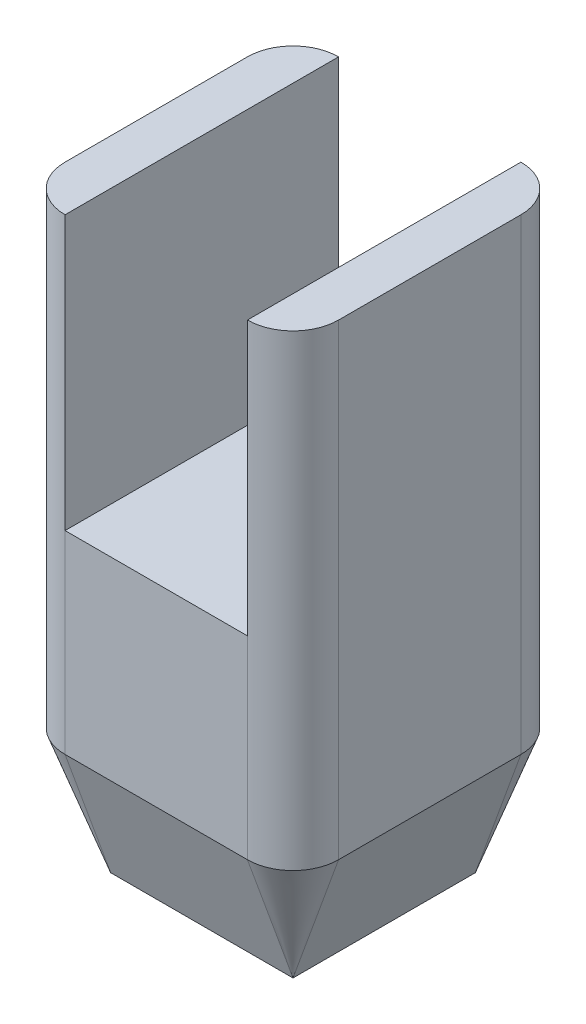
ISO-10303-21;
HEADER;
FILE_DESCRIPTION(('STEP AP214'),'2;1');
FILE_NAME('part.step','',(''),(''),'','','');
FILE_SCHEMA(('AUTOMOTIVE_DESIGN { 1 0 10303 214 1 1 1 1 }'));
ENDSEC;
DATA;
#1=APPLICATION_CONTEXT('core data for automotive mechanical design processes');
#2=APPLICATION_PROTOCOL_DEFINITION('international standard','automotive_design',2000,#1);
#3=PRODUCT_CONTEXT('',#1,'mechanical');
#4=PRODUCT('Part','Part','',(#3));
#5=PRODUCT_RELATED_PRODUCT_CATEGORY('part','',(#4));
#6=PRODUCT_DEFINITION_FORMATION('','',#4);
#7=PRODUCT_DEFINITION_CONTEXT('part definition',#1,'design');
#8=PRODUCT_DEFINITION('design','',#6,#7);
#9=PRODUCT_DEFINITION_SHAPE('','',#8);
#10=(LENGTH_UNIT() NAMED_UNIT(*) SI_UNIT(.MILLI.,.METRE.));
#11=(NAMED_UNIT(*) PLANE_ANGLE_UNIT() SI_UNIT($,.RADIAN.));
#12=(NAMED_UNIT(*) SI_UNIT($,.STERADIAN.) SOLID_ANGLE_UNIT());
#13=UNCERTAINTY_MEASURE_WITH_UNIT(LENGTH_MEASURE(1.E-05),#10,'distance_accuracy_value','');
#14=(GEOMETRIC_REPRESENTATION_CONTEXT(3) GLOBAL_UNCERTAINTY_ASSIGNED_CONTEXT((#13)) GLOBAL_UNIT_ASSIGNED_CONTEXT((#10,
#11,#12)) REPRESENTATION_CONTEXT('',''));
#15=CARTESIAN_POINT('',(0.,0.,0.));
#16=DIRECTION('',(0.,0.,1.));
#17=DIRECTION('',(1.,0.,0.));
#18=AXIS2_PLACEMENT_3D('',#15,#16,#17);
#19=CARTESIAN_POINT('',(0.,3.5,0.));
#20=DIRECTION('',(0.,1.,0.));
#21=DIRECTION('',(0.,0.,1.));
#22=AXIS2_PLACEMENT_3D('',#19,#20,#21);
#23=PLANE('',#22);
#24=DIRECTION('',(-1.,0.,0.));
#25=VECTOR('',#24,1.);
#26=CARTESIAN_POINT('',(-1.5,3.5,-1.5));
#27=LINE('',#26,#25);
#28=CARTESIAN_POINT('',(1.,3.5,-1.5));
#29=VERTEX_POINT('',#28);
#30=CARTESIAN_POINT('',(-1.,3.5,-1.5));
#31=VERTEX_POINT('',#30);
#32=EDGE_CURVE('E184',#29,#31,#27,.T.);
#33=ORIENTED_EDGE('',*,*,#32,.T.);
#34=DIRECTION('',(0.,0.,-1.));
#35=VECTOR('',#34,1.);
#36=CARTESIAN_POINT('',(-1.,3.5,-1.5));
#37=LINE('',#36,#35);
#38=CARTESIAN_POINT('',(-1.,3.5,1.5));
#39=VERTEX_POINT('',#38);
#40=EDGE_CURVE('E149',#39,#31,#37,.T.);
#41=ORIENTED_EDGE('',*,*,#40,.F.);
#42=DIRECTION('',(1.,0.,0.));
#43=VECTOR('',#42,1.);
#44=CARTESIAN_POINT('',(-1.5,3.5,1.5));
#45=LINE('',#44,#43);
#46=CARTESIAN_POINT('',(1.,3.5,1.5));
#47=VERTEX_POINT('',#46);
#48=EDGE_CURVE('E182',#39,#47,#45,.T.);
#49=ORIENTED_EDGE('',*,*,#48,.T.);
#50=DIRECTION('',(0.,0.,1.));
#51=VECTOR('',#50,1.);
#52=CARTESIAN_POINT('',(1.,3.5,-1.5));
#53=LINE('',#52,#51);
#54=EDGE_CURVE('E161',#29,#47,#53,.T.);
#55=ORIENTED_EDGE('',*,*,#54,.F.);
#56=EDGE_LOOP('',(#33,#41,#49,#55));
#57=FACE_BOUND('',#56,.T.);
#58=ADVANCED_FACE('F33',(#57),#23,.T.);
#59=CARTESIAN_POINT('',(-1.5,3.5,-1.5));
#60=DIRECTION('',(1.,0.,0.));
#61=DIRECTION('',(0.,0.,-1.));
#62=AXIS2_PLACEMENT_3D('',#59,#60,#61);
#63=PLANE('',#62);
#64=DIRECTION('',(0.,-1.,0.));
#65=VECTOR('',#64,1.);
#66=CARTESIAN_POINT('',(-1.5,3.5,-1.));
#67=LINE('',#66,#65);
#68=CARTESIAN_POINT('',(-1.5,6.5,-1.));
#69=VERTEX_POINT('',#68);
#70=CARTESIAN_POINT('',(-1.5,1.37373870972731,-1.));
#71=VERTEX_POINT('',#70);
#72=EDGE_CURVE('E124',#69,#71,#67,.T.);
#73=ORIENTED_EDGE('',*,*,#72,.T.);
#74=DIRECTION('',(0.,0.,1.));
#75=VECTOR('',#74,1.);
#76=CARTESIAN_POINT('',(-1.5,1.37373870972731,-1.5));
#77=LINE('',#76,#75);
#78=CARTESIAN_POINT('',(-1.5,1.37373870972731,1.));
#79=VERTEX_POINT('',#78);
#80=EDGE_CURVE('E216',#71,#79,#77,.T.);
#81=ORIENTED_EDGE('',*,*,#80,.T.);
#82=DIRECTION('',(0.,-1.,0.));
#83=VECTOR('',#82,1.);
#84=CARTESIAN_POINT('',(-1.5,3.5,1.));
#85=LINE('',#84,#83);
#86=CARTESIAN_POINT('',(-1.5,6.5,1.));
#87=VERTEX_POINT('',#86);
#88=EDGE_CURVE('E136',#79,#87,#85,.F.);
#89=ORIENTED_EDGE('',*,*,#88,.T.);
#90=DIRECTION('',(0.,0.,1.));
#91=VECTOR('',#90,1.);
#92=CARTESIAN_POINT('',(-1.5,6.5,-1.));
#93=LINE('',#92,#91);
#94=EDGE_CURVE('E139',#69,#87,#93,.T.);
#95=ORIENTED_EDGE('',*,*,#94,.F.);
#96=EDGE_LOOP('',(#73,#81,#89,#95));
#97=FACE_BOUND('',#96,.T.);
#98=ADVANCED_FACE('F140',(#97),#63,.F.);
#99=CARTESIAN_POINT('',(-1.5,3.5,1.5));
#100=DIRECTION('',(0.,0.,-1.));
#101=DIRECTION('',(-1.,0.,0.));
#102=AXIS2_PLACEMENT_3D('',#99,#100,#101);
#103=PLANE('',#102);
#104=DIRECTION('',(0.,-1.,0.));
#105=VECTOR('',#104,1.);
#106=CARTESIAN_POINT('',(-1.,3.5,1.5));
#107=LINE('',#106,#105);
#108=CARTESIAN_POINT('',(-1.,1.37373870972731,1.5));
#109=VERTEX_POINT('',#108);
#110=EDGE_CURVE('E199',#39,#109,#107,.T.);
#111=ORIENTED_EDGE('',*,*,#110,.T.);
#112=DIRECTION('',(1.,0.,0.));
#113=VECTOR('',#112,1.);
#114=CARTESIAN_POINT('',(-1.5,1.37373870972731,1.5));
#115=LINE('',#114,#113);
#116=CARTESIAN_POINT('',(1.,1.37373870972731,1.5));
#117=VERTEX_POINT('',#116);
#118=EDGE_CURVE('E11',#109,#117,#115,.T.);
#119=ORIENTED_EDGE('',*,*,#118,.T.);
#120=DIRECTION('',(0.,-1.,0.));
#121=VECTOR('',#120,1.);
#122=CARTESIAN_POINT('',(1.,3.5,1.5));
#123=LINE('',#122,#121);
#124=EDGE_CURVE('E197',#117,#47,#123,.F.);
#125=ORIENTED_EDGE('',*,*,#124,.T.);
#126=ORIENTED_EDGE('',*,*,#48,.F.);
#127=EDGE_LOOP('',(#111,#119,#125,#126));
#128=FACE_BOUND('',#127,.T.);
#129=ADVANCED_FACE('F271',(#128),#103,.F.);
#130=CARTESIAN_POINT('',(1.5,3.5,-1.5));
#131=DIRECTION('',(-1.,0.,0.));
#132=DIRECTION('',(0.,0.,1.));
#133=AXIS2_PLACEMENT_3D('',#130,#131,#132);
#134=PLANE('',#133);
#135=DIRECTION('',(0.,-1.,0.));
#136=VECTOR('',#135,1.);
#137=CARTESIAN_POINT('',(1.5,3.5,1.));
#138=LINE('',#137,#136);
#139=CARTESIAN_POINT('',(1.5,6.5,1.));
#140=VERTEX_POINT('',#139);
#141=CARTESIAN_POINT('',(1.5,1.37373870972731,1.));
#142=VERTEX_POINT('',#141);
#143=EDGE_CURVE('E192',#140,#142,#138,.T.);
#144=ORIENTED_EDGE('',*,*,#143,.T.);
#145=DIRECTION('',(0.,0.,-1.));
#146=VECTOR('',#145,1.);
#147=CARTESIAN_POINT('',(1.5,1.37373870972731,-1.5));
#148=LINE('',#147,#146);
#149=CARTESIAN_POINT('',(1.5,1.37373870972731,-1.));
#150=VERTEX_POINT('',#149);
#151=EDGE_CURVE('E218',#142,#150,#148,.T.);
#152=ORIENTED_EDGE('',*,*,#151,.T.);
#153=DIRECTION('',(0.,-1.,0.));
#154=VECTOR('',#153,1.);
#155=CARTESIAN_POINT('',(1.5,3.5,-1.));
#156=LINE('',#155,#154);
#157=CARTESIAN_POINT('',(1.5,6.5,-1.));
#158=VERTEX_POINT('',#157);
#159=EDGE_CURVE('E195',#150,#158,#156,.F.);
#160=ORIENTED_EDGE('',*,*,#159,.T.);
#161=DIRECTION('',(0.,0.,-1.));
#162=VECTOR('',#161,1.);
#163=CARTESIAN_POINT('',(1.5,6.5,1.));
#164=LINE('',#163,#162);
#165=EDGE_CURVE('E170',#140,#158,#164,.T.);
#166=ORIENTED_EDGE('',*,*,#165,.F.);
#167=EDGE_LOOP('',(#144,#152,#160,#166));
#168=FACE_BOUND('',#167,.T.);
#169=ADVANCED_FACE('F257',(#168),#134,.F.);
#170=CARTESIAN_POINT('',(-1.5,3.5,-1.5));
#171=DIRECTION('',(0.,0.,1.));
#172=DIRECTION('',(1.,0.,0.));
#173=AXIS2_PLACEMENT_3D('',#170,#171,#172);
#174=PLANE('',#173);
#175=DIRECTION('',(0.,-1.,0.));
#176=VECTOR('',#175,1.);
#177=CARTESIAN_POINT('',(1.,3.5,-1.5));
#178=LINE('',#177,#176);
#179=CARTESIAN_POINT('',(1.,1.37373870972731,-1.5));
#180=VERTEX_POINT('',#179);
#181=EDGE_CURVE('E135',#29,#180,#178,.T.);
#182=ORIENTED_EDGE('',*,*,#181,.T.);
#183=DIRECTION('',(-1.,0.,0.));
#184=VECTOR('',#183,1.);
#185=CARTESIAN_POINT('',(-1.5,1.37373870972731,-1.5));
#186=LINE('',#185,#184);
#187=CARTESIAN_POINT('',(-1.,1.37373870972731,-1.5));
#188=VERTEX_POINT('',#187);
#189=EDGE_CURVE('E201',#180,#188,#186,.T.);
#190=ORIENTED_EDGE('',*,*,#189,.T.);
#191=DIRECTION('',(0.,-1.,0.));
#192=VECTOR('',#191,1.);
#193=CARTESIAN_POINT('',(-1.,3.5,-1.5));
#194=LINE('',#193,#192);
#195=EDGE_CURVE('E190',#188,#31,#194,.F.);
#196=ORIENTED_EDGE('',*,*,#195,.T.);
#197=ORIENTED_EDGE('',*,*,#32,.F.);
#198=EDGE_LOOP('',(#182,#190,#196,#197));
#199=FACE_BOUND('',#198,.T.);
#200=ADVANCED_FACE('F278',(#199),#174,.F.);
#201=CARTESIAN_POINT('',(0.,0.,0.));
#202=DIRECTION('',(0.,1.,0.));
#203=DIRECTION('',(0.,0.,1.));
#204=AXIS2_PLACEMENT_3D('',#201,#202,#203);
#205=PLANE('',#204);
#206=DIRECTION('',(0.,0.,-1.));
#207=VECTOR('',#206,1.);
#208=CARTESIAN_POINT('',(-0.999999999999999,0.,0.));
#209=LINE('',#208,#207);
#210=CARTESIAN_POINT('',(-1.,0.,0.999999999999999));
#211=VERTEX_POINT('',#210);
#212=CARTESIAN_POINT('',(-1.,0.,-1.));
#213=VERTEX_POINT('',#212);
#214=EDGE_CURVE('E208',#211,#213,#209,.T.);
#215=ORIENTED_EDGE('',*,*,#214,.T.);
#216=DIRECTION('',(1.,0.,0.));
#217=VECTOR('',#216,1.);
#218=CARTESIAN_POINT('',(0.,0.,-0.999999999999999));
#219=LINE('',#218,#217);
#220=CARTESIAN_POINT('',(0.999999999999999,0.,-1.));
#221=VERTEX_POINT('',#220);
#222=EDGE_CURVE('E210',#213,#221,#219,.T.);
#223=ORIENTED_EDGE('',*,*,#222,.T.);
#224=DIRECTION('',(0.,0.,1.));
#225=VECTOR('',#224,1.);
#226=CARTESIAN_POINT('',(0.999999999999999,0.,0.));
#227=LINE('',#226,#225);
#228=CARTESIAN_POINT('',(1.,0.,0.999999999999999));
#229=VERTEX_POINT('',#228);
#230=EDGE_CURVE('E206',#221,#229,#227,.T.);
#231=ORIENTED_EDGE('',*,*,#230,.T.);
#232=DIRECTION('',(-1.,0.,0.));
#233=VECTOR('',#232,1.);
#234=CARTESIAN_POINT('',(0.,0.,0.999999999999999));
#235=LINE('',#234,#233);
#236=EDGE_CURVE('E204',#229,#211,#235,.T.);
#237=ORIENTED_EDGE('',*,*,#236,.T.);
#238=EDGE_LOOP('',(#215,#223,#231,#237));
#239=FACE_BOUND('',#238,.T.);
#240=ADVANCED_FACE('F292',(#239),#205,.F.);
#241=CARTESIAN_POINT('',(-1.,3.5,-1.));
#242=DIRECTION('',(0.,-1.,0.));
#243=DIRECTION('',(0.,0.,-1.));
#244=AXIS2_PLACEMENT_3D('',#241,#242,#243);
#245=CYLINDRICAL_SURFACE('',#244,0.5);
#246=ORIENTED_EDGE('',*,*,#195,.F.);
#247=CARTESIAN_POINT('',(-1.,1.37373870972731,-1.));
#248=DIRECTION('',(0.,1.,0.));
#249=DIRECTION('',(0.,0.,1.));
#250=AXIS2_PLACEMENT_3D('',#247,#248,#249);
#251=CIRCLE('',#250,0.5);
#252=EDGE_CURVE('E132',#188,#71,#251,.T.);
#253=ORIENTED_EDGE('',*,*,#252,.T.);
#254=ORIENTED_EDGE('',*,*,#72,.F.);
#255=CARTESIAN_POINT('',(-1.,6.5,-1.));
#256=DIRECTION('',(0.,1.,0.));
#257=DIRECTION('',(0.,0.,1.));
#258=AXIS2_PLACEMENT_3D('',#255,#256,#257);
#259=CIRCLE('',#258,0.5);
#260=CARTESIAN_POINT('',(-1.,6.5,-1.5));
#261=VERTEX_POINT('',#260);
#262=EDGE_CURVE('E130',#261,#69,#259,.T.);
#263=ORIENTED_EDGE('',*,*,#262,.F.);
#264=DIRECTION('',(0.,-1.,0.));
#265=VECTOR('',#264,1.);
#266=CARTESIAN_POINT('',(-1.,6.5,-1.5));
#267=LINE('',#266,#265);
#268=EDGE_CURVE('E155',#261,#31,#267,.T.);
#269=ORIENTED_EDGE('',*,*,#268,.T.);
#270=EDGE_LOOP('',(#246,#253,#254,#263,#269));
#271=FACE_BOUND('',#270,.T.);
#272=ADVANCED_FACE('F127',(#271),#245,.T.);
#273=CARTESIAN_POINT('',(1.,3.5,-1.));
#274=DIRECTION('',(0.,-1.,0.));
#275=DIRECTION('',(0.,0.,-1.));
#276=AXIS2_PLACEMENT_3D('',#273,#274,#275);
#277=CYLINDRICAL_SURFACE('',#276,0.5);
#278=ORIENTED_EDGE('',*,*,#159,.F.);
#279=CARTESIAN_POINT('',(1.,1.37373870972731,-1.));
#280=DIRECTION('',(0.,1.,0.));
#281=DIRECTION('',(0.,0.,1.));
#282=AXIS2_PLACEMENT_3D('',#279,#280,#281);
#283=CIRCLE('',#282,0.5);
#284=EDGE_CURVE('E214',#150,#180,#283,.T.);
#285=ORIENTED_EDGE('',*,*,#284,.T.);
#286=ORIENTED_EDGE('',*,*,#181,.F.);
#287=DIRECTION('',(0.,-1.,0.));
#288=VECTOR('',#287,1.);
#289=CARTESIAN_POINT('',(1.,6.5,-1.5));
#290=LINE('',#289,#288);
#291=CARTESIAN_POINT('',(1.,6.5,-1.5));
#292=VERTEX_POINT('',#291);
#293=EDGE_CURVE('E178',#292,#29,#290,.T.);
#294=ORIENTED_EDGE('',*,*,#293,.F.);
#295=CARTESIAN_POINT('',(1.,6.5,-1.));
#296=DIRECTION('',(0.,1.,0.));
#297=DIRECTION('',(0.,0.,1.));
#298=AXIS2_PLACEMENT_3D('',#295,#296,#297);
#299=CIRCLE('',#298,0.5);
#300=EDGE_CURVE('E162',#158,#292,#299,.T.);
#301=ORIENTED_EDGE('',*,*,#300,.F.);
#302=EDGE_LOOP('',(#278,#285,#286,#294,#301));
#303=FACE_BOUND('',#302,.T.);
#304=ADVANCED_FACE('F261',(#303),#277,.T.);
#305=CARTESIAN_POINT('',(-1.,3.5,1.));
#306=DIRECTION('',(0.,-1.,0.));
#307=DIRECTION('',(0.,0.,-1.));
#308=AXIS2_PLACEMENT_3D('',#305,#306,#307);
#309=CYLINDRICAL_SURFACE('',#308,0.5);
#310=ORIENTED_EDGE('',*,*,#88,.F.);
#311=CARTESIAN_POINT('',(-1.,1.37373870972731,1.));
#312=DIRECTION('',(0.,1.,0.));
#313=DIRECTION('',(0.,0.,1.));
#314=AXIS2_PLACEMENT_3D('',#311,#312,#313);
#315=CIRCLE('',#314,0.5);
#316=EDGE_CURVE('E56',#79,#109,#315,.T.);
#317=ORIENTED_EDGE('',*,*,#316,.T.);
#318=ORIENTED_EDGE('',*,*,#110,.F.);
#319=DIRECTION('',(0.,-1.,0.));
#320=VECTOR('',#319,1.);
#321=CARTESIAN_POINT('',(-1.,6.5,1.5));
#322=LINE('',#321,#320);
#323=CARTESIAN_POINT('',(-1.,6.5,1.5));
#324=VERTEX_POINT('',#323);
#325=EDGE_CURVE('E158',#324,#39,#322,.T.);
#326=ORIENTED_EDGE('',*,*,#325,.F.);
#327=CARTESIAN_POINT('',(-1.,6.5,1.));
#328=DIRECTION('',(0.,1.,0.));
#329=DIRECTION('',(0.,0.,1.));
#330=AXIS2_PLACEMENT_3D('',#327,#328,#329);
#331=CIRCLE('',#330,0.5);
#332=EDGE_CURVE('E143',#87,#324,#331,.T.);
#333=ORIENTED_EDGE('',*,*,#332,.F.);
#334=EDGE_LOOP('',(#310,#317,#318,#326,#333));
#335=FACE_BOUND('',#334,.T.);
#336=ADVANCED_FACE('F284',(#335),#309,.T.);
#337=CARTESIAN_POINT('',(1.,3.5,1.));
#338=DIRECTION('',(0.,-1.,0.));
#339=DIRECTION('',(0.,0.,-1.));
#340=AXIS2_PLACEMENT_3D('',#337,#338,#339);
#341=CYLINDRICAL_SURFACE('',#340,0.5);
#342=ORIENTED_EDGE('',*,*,#124,.F.);
#343=CARTESIAN_POINT('',(1.,1.37373870972731,1.));
#344=DIRECTION('',(0.,1.,0.));
#345=DIRECTION('',(0.,0.,1.));
#346=AXIS2_PLACEMENT_3D('',#343,#344,#345);
#347=CIRCLE('',#346,0.5);
#348=EDGE_CURVE('E42',#117,#142,#347,.T.);
#349=ORIENTED_EDGE('',*,*,#348,.T.);
#350=ORIENTED_EDGE('',*,*,#143,.F.);
#351=CARTESIAN_POINT('',(1.,6.5,1.));
#352=DIRECTION('',(0.,1.,0.));
#353=DIRECTION('',(0.,0.,1.));
#354=AXIS2_PLACEMENT_3D('',#351,#352,#353);
#355=CIRCLE('',#354,0.5);
#356=CARTESIAN_POINT('',(1.,6.5,1.5));
#357=VERTEX_POINT('',#356);
#358=EDGE_CURVE('E167',#357,#140,#355,.T.);
#359=ORIENTED_EDGE('',*,*,#358,.F.);
#360=DIRECTION('',(0.,-1.,0.));
#361=VECTOR('',#360,1.);
#362=CARTESIAN_POINT('',(1.,6.5,1.5));
#363=LINE('',#362,#361);
#364=EDGE_CURVE('E173',#357,#47,#363,.T.);
#365=ORIENTED_EDGE('',*,*,#364,.T.);
#366=EDGE_LOOP('',(#342,#349,#350,#359,#365));
#367=FACE_BOUND('',#366,.T.);
#368=ADVANCED_FACE('F269',(#367),#341,.T.);
#369=CARTESIAN_POINT('',(-1.5,1.37373870972731,1.5));
#370=DIRECTION('',(0.,0.34202014332567,-0.939692620785908));
#371=DIRECTION('',(1.,0.,0.));
#372=AXIS2_PLACEMENT_3D('',#369,#370,#371);
#373=PLANE('',#372);
#374=DIRECTION('',(0.,-0.939692620785908,-0.34202014332567));
#375=VECTOR('',#374,1.);
#376=CARTESIAN_POINT('',(1.,1.37373870972731,1.5));
#377=LINE('',#376,#375);
#378=EDGE_CURVE('E37',#117,#229,#377,.T.);
#379=ORIENTED_EDGE('',*,*,#378,.F.);
#380=ORIENTED_EDGE('',*,*,#118,.F.);
#381=DIRECTION('',(0.,0.939692620785908,0.34202014332567));
#382=VECTOR('',#381,1.);
#383=CARTESIAN_POINT('',(-1.,0.,0.999999999999999));
#384=LINE('',#383,#382);
#385=EDGE_CURVE('E236',#211,#109,#384,.T.);
#386=ORIENTED_EDGE('',*,*,#385,.F.);
#387=ORIENTED_EDGE('',*,*,#236,.F.);
#388=EDGE_LOOP('',(#379,#380,#386,#387));
#389=FACE_BOUND('',#388,.T.);
#390=ADVANCED_FACE('F35',(#389),#373,.F.);
#391=CARTESIAN_POINT('',(1.,1.37373870972731,1.));
#392=DIRECTION('',(0.,1.,0.));
#393=DIRECTION('',(0.,0.,1.));
#394=AXIS2_PLACEMENT_3D('',#391,#392,#393);
#395=CONICAL_SURFACE('',#394,0.500000000000001,0.349065850398867);
#396=ORIENTED_EDGE('',*,*,#348,.F.);
#397=ORIENTED_EDGE('',*,*,#378,.T.);
#398=DIRECTION('',(-0.342020143325669,-0.939692620785908,0.));
#399=VECTOR('',#398,1.);
#400=CARTESIAN_POINT('',(1.5,1.37373870972731,1.));
#401=LINE('',#400,#399);
#402=EDGE_CURVE('E234',#142,#229,#401,.T.);
#403=ORIENTED_EDGE('',*,*,#402,.F.);
#404=EDGE_LOOP('',(#396,#397,#403));
#405=FACE_BOUND('',#404,.T.);
#406=ADVANCED_FACE('F246',(#405),#395,.T.);
#407=CARTESIAN_POINT('',(-1.,1.37373870972731,1.));
#408=DIRECTION('',(0.,1.,0.));
#409=DIRECTION('',(0.,0.,1.));
#410=AXIS2_PLACEMENT_3D('',#407,#408,#409);
#411=CONICAL_SURFACE('',#410,0.500000000000001,0.349065850398867);
#412=ORIENTED_EDGE('',*,*,#385,.T.);
#413=ORIENTED_EDGE('',*,*,#316,.F.);
#414=DIRECTION('',(-0.342020143325669,0.939692620785908,0.));
#415=VECTOR('',#414,1.);
#416=CARTESIAN_POINT('',(-0.999999999999999,0.,1.));
#417=LINE('',#416,#415);
#418=EDGE_CURVE('E231',#211,#79,#417,.T.);
#419=ORIENTED_EDGE('',*,*,#418,.F.);
#420=EDGE_LOOP('',(#412,#413,#419));
#421=FACE_BOUND('',#420,.T.);
#422=ADVANCED_FACE('F286',(#421),#411,.T.);
#423=CARTESIAN_POINT('',(1.5,1.37373870972731,-1.5));
#424=DIRECTION('',(-0.939692620785908,0.342020143325669,0.));
#425=DIRECTION('',(0.,0.,-1.));
#426=AXIS2_PLACEMENT_3D('',#423,#424,#425);
#427=PLANE('',#426);
#428=ORIENTED_EDGE('',*,*,#402,.T.);
#429=ORIENTED_EDGE('',*,*,#230,.F.);
#430=DIRECTION('',(-0.342020143325669,-0.939692620785908,0.));
#431=VECTOR('',#430,1.);
#432=CARTESIAN_POINT('',(1.5,1.37373870972731,-1.));
#433=LINE('',#432,#431);
#434=EDGE_CURVE('E228',#150,#221,#433,.T.);
#435=ORIENTED_EDGE('',*,*,#434,.F.);
#436=ORIENTED_EDGE('',*,*,#151,.F.);
#437=EDGE_LOOP('',(#428,#429,#435,#436));
#438=FACE_BOUND('',#437,.T.);
#439=ADVANCED_FACE('F252',(#438),#427,.F.);
#440=CARTESIAN_POINT('',(-1.5,1.37373870972731,-1.5));
#441=DIRECTION('',(0.939692620785908,0.342020143325669,0.));
#442=DIRECTION('',(0.,0.,1.));
#443=AXIS2_PLACEMENT_3D('',#440,#441,#442);
#444=PLANE('',#443);
#445=ORIENTED_EDGE('',*,*,#418,.T.);
#446=ORIENTED_EDGE('',*,*,#80,.F.);
#447=DIRECTION('',(-0.342020143325669,0.939692620785908,0.));
#448=VECTOR('',#447,1.);
#449=CARTESIAN_POINT('',(-1.,0.,-1.));
#450=LINE('',#449,#448);
#451=EDGE_CURVE('E225',#213,#71,#450,.T.);
#452=ORIENTED_EDGE('',*,*,#451,.F.);
#453=ORIENTED_EDGE('',*,*,#214,.F.);
#454=EDGE_LOOP('',(#445,#446,#452,#453));
#455=FACE_BOUND('',#454,.T.);
#456=ADVANCED_FACE('F289',(#455),#444,.F.);
#457=CARTESIAN_POINT('',(1.,1.37373870972731,-1.));
#458=DIRECTION('',(0.,1.,0.));
#459=DIRECTION('',(0.,0.,1.));
#460=AXIS2_PLACEMENT_3D('',#457,#458,#459);
#461=CONICAL_SURFACE('',#460,0.500000000000001,0.349065850398867);
#462=ORIENTED_EDGE('',*,*,#284,.F.);
#463=ORIENTED_EDGE('',*,*,#434,.T.);
#464=DIRECTION('',(0.,-0.939692620785908,0.34202014332567));
#465=VECTOR('',#464,1.);
#466=CARTESIAN_POINT('',(1.,1.37373870972731,-1.5));
#467=LINE('',#466,#465);
#468=EDGE_CURVE('E223',#180,#221,#467,.T.);
#469=ORIENTED_EDGE('',*,*,#468,.F.);
#470=EDGE_LOOP('',(#462,#463,#469));
#471=FACE_BOUND('',#470,.T.);
#472=ADVANCED_FACE('F299',(#471),#461,.T.);
#473=CARTESIAN_POINT('',(-1.,1.37373870972731,-1.));
#474=DIRECTION('',(0.,1.,0.));
#475=DIRECTION('',(0.,0.,1.));
#476=AXIS2_PLACEMENT_3D('',#473,#474,#475);
#477=CONICAL_SURFACE('',#476,0.500000000000001,0.349065850398867);
#478=ORIENTED_EDGE('',*,*,#451,.T.);
#479=ORIENTED_EDGE('',*,*,#252,.F.);
#480=DIRECTION('',(0.,0.939692620785908,-0.34202014332567));
#481=VECTOR('',#480,1.);
#482=CARTESIAN_POINT('',(-1.,0.,-0.999999999999999));
#483=LINE('',#482,#481);
#484=EDGE_CURVE('E181',#213,#188,#483,.T.);
#485=ORIENTED_EDGE('',*,*,#484,.F.);
#486=EDGE_LOOP('',(#478,#479,#485));
#487=FACE_BOUND('',#486,.T.);
#488=ADVANCED_FACE('F297',(#487),#477,.T.);
#489=CARTESIAN_POINT('',(-1.5,1.37373870972731,-1.5));
#490=DIRECTION('',(0.,0.34202014332567,0.939692620785908));
#491=DIRECTION('',(-1.,0.,0.));
#492=AXIS2_PLACEMENT_3D('',#489,#490,#491);
#493=PLANE('',#492);
#494=ORIENTED_EDGE('',*,*,#468,.T.);
#495=ORIENTED_EDGE('',*,*,#222,.F.);
#496=ORIENTED_EDGE('',*,*,#484,.T.);
#497=ORIENTED_EDGE('',*,*,#189,.F.);
#498=EDGE_LOOP('',(#494,#495,#496,#497));
#499=FACE_BOUND('',#498,.T.);
#500=ADVANCED_FACE('F295',(#499),#493,.F.);
#501=CARTESIAN_POINT('',(1.,6.5,-1.5));
#502=DIRECTION('',(1.,0.,0.));
#503=DIRECTION('',(0.,0.,-1.));
#504=AXIS2_PLACEMENT_3D('',#501,#502,#503);
#505=PLANE('',#504);
#506=ORIENTED_EDGE('',*,*,#54,.T.);
#507=ORIENTED_EDGE('',*,*,#364,.F.);
#508=DIRECTION('',(0.,0.,1.));
#509=VECTOR('',#508,1.);
#510=CARTESIAN_POINT('',(1.,6.5,-1.5));
#511=LINE('',#510,#509);
#512=EDGE_CURVE('E165',#292,#357,#511,.T.);
#513=ORIENTED_EDGE('',*,*,#512,.F.);
#514=ORIENTED_EDGE('',*,*,#293,.T.);
#515=EDGE_LOOP('',(#506,#507,#513,#514));
#516=FACE_BOUND('',#515,.T.);
#517=ADVANCED_FACE('F274',(#516),#505,.F.);
#518=CARTESIAN_POINT('',(1.,6.5,-1.));
#519=DIRECTION('',(0.,1.,0.));
#520=DIRECTION('',(0.,0.,1.));
#521=AXIS2_PLACEMENT_3D('',#518,#519,#520);
#522=PLANE('',#521);
#523=ORIENTED_EDGE('',*,*,#300,.T.);
#524=ORIENTED_EDGE('',*,*,#512,.T.);
#525=ORIENTED_EDGE('',*,*,#358,.T.);
#526=ORIENTED_EDGE('',*,*,#165,.T.);
#527=EDGE_LOOP('',(#523,#524,#525,#526));
#528=FACE_BOUND('',#527,.T.);
#529=ADVANCED_FACE('F265',(#528),#522,.T.);
#530=CARTESIAN_POINT('',(-1.,6.5,-1.5));
#531=DIRECTION('',(-1.,0.,0.));
#532=DIRECTION('',(0.,0.,1.));
#533=AXIS2_PLACEMENT_3D('',#530,#531,#532);
#534=PLANE('',#533);
#535=ORIENTED_EDGE('',*,*,#40,.T.);
#536=ORIENTED_EDGE('',*,*,#268,.F.);
#537=DIRECTION('',(0.,0.,-1.));
#538=VECTOR('',#537,1.);
#539=CARTESIAN_POINT('',(-1.,6.5,-1.5));
#540=LINE('',#539,#538);
#541=EDGE_CURVE('E147',#324,#261,#540,.T.);
#542=ORIENTED_EDGE('',*,*,#541,.F.);
#543=ORIENTED_EDGE('',*,*,#325,.T.);
#544=EDGE_LOOP('',(#535,#536,#542,#543));
#545=FACE_BOUND('',#544,.T.);
#546=ADVANCED_FACE('F282',(#545),#534,.F.);
#547=CARTESIAN_POINT('',(-1.,6.5,-1.));
#548=DIRECTION('',(0.,1.,0.));
#549=DIRECTION('',(0.,0.,1.));
#550=AXIS2_PLACEMENT_3D('',#547,#548,#549);
#551=PLANE('',#550);
#552=ORIENTED_EDGE('',*,*,#262,.T.);
#553=ORIENTED_EDGE('',*,*,#94,.T.);
#554=ORIENTED_EDGE('',*,*,#332,.T.);
#555=ORIENTED_EDGE('',*,*,#541,.T.);
#556=EDGE_LOOP('',(#552,#553,#554,#555));
#557=FACE_BOUND('',#556,.T.);
#558=ADVANCED_FACE('F145',(#557),#551,.T.);
#559=CLOSED_SHELL('',(#58,#98,#129,#169,#200,#240,#272,#304,#336,#368,#390,#406,#422,#439,#456,
#472,#488,#500,#517,#529,#546,#558));
#560=MANIFOLD_SOLID_BREP('B2',#559);
#561=ADVANCED_BREP_SHAPE_REPRESENTATION('',(#18,#560),#14);
#562=SHAPE_DEFINITION_REPRESENTATION(#9,#561);
ENDSEC;
END-ISO-10303-21;
